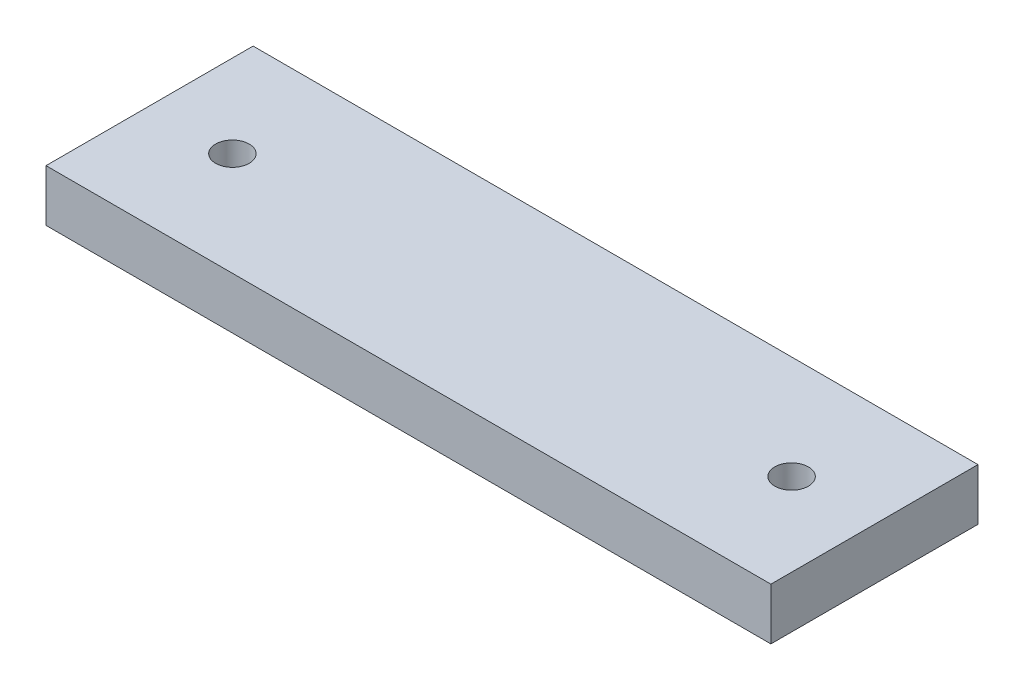
ISO-10303-21;
HEADER;
FILE_DESCRIPTION(('STEP AP214'),'2;1');
FILE_NAME('part.step','',(''),(''),'','','');
FILE_SCHEMA(('AUTOMOTIVE_DESIGN { 1 0 10303 214 1 1 1 1 }'));
ENDSEC;
DATA;
#1=APPLICATION_CONTEXT('core data for automotive mechanical design processes');
#2=APPLICATION_PROTOCOL_DEFINITION('international standard','automotive_design',2000,#1);
#3=PRODUCT_CONTEXT('',#1,'mechanical');
#4=PRODUCT('Part','Part','',(#3));
#5=PRODUCT_RELATED_PRODUCT_CATEGORY('part','',(#4));
#6=PRODUCT_DEFINITION_FORMATION('','',#4);
#7=PRODUCT_DEFINITION_CONTEXT('part definition',#1,'design');
#8=PRODUCT_DEFINITION('design','',#6,#7);
#9=PRODUCT_DEFINITION_SHAPE('','',#8);
#10=(LENGTH_UNIT() NAMED_UNIT(*) SI_UNIT(.MILLI.,.METRE.));
#11=(NAMED_UNIT(*) PLANE_ANGLE_UNIT() SI_UNIT($,.RADIAN.));
#12=(NAMED_UNIT(*) SI_UNIT($,.STERADIAN.) SOLID_ANGLE_UNIT());
#13=UNCERTAINTY_MEASURE_WITH_UNIT(LENGTH_MEASURE(1.E-05),#10,'distance_accuracy_value','');
#14=(GEOMETRIC_REPRESENTATION_CONTEXT(3) GLOBAL_UNCERTAINTY_ASSIGNED_CONTEXT((#13)) GLOBAL_UNIT_ASSIGNED_CONTEXT((#10,
#11,#12)) REPRESENTATION_CONTEXT('',''));
#15=CARTESIAN_POINT('',(0.,0.,0.));
#16=DIRECTION('',(0.,0.,1.));
#17=DIRECTION('',(1.,0.,0.));
#18=AXIS2_PLACEMENT_3D('',#15,#16,#17);
#19=CARTESIAN_POINT('',(0.,3.175,0.));
#20=DIRECTION('',(0.,-1.,0.));
#21=DIRECTION('',(0.,0.,-1.));
#22=AXIS2_PLACEMENT_3D('',#19,#20,#21);
#23=PLANE('',#22);
#24=CARTESIAN_POINT('',(-17.145,3.175,0.));
#25=DIRECTION('',(0.,1.,0.));
#26=DIRECTION('',(0.,0.,1.));
#27=AXIS2_PLACEMENT_3D('',#24,#25,#26);
#28=CIRCLE('',#27,1.0287);
#29=CARTESIAN_POINT('',(-17.145,3.175,1.0287));
#30=VERTEX_POINT('',#29);
#31=EDGE_CURVE('E100',#30,#30,#28,.T.);
#32=ORIENTED_EDGE('',*,*,#31,.F.);
#33=EDGE_LOOP('',(#32));
#34=FACE_BOUND('',#33,.T.);
#35=DIRECTION('',(0.,0.,-1.));
#36=VECTOR('',#35,1.);
#37=CARTESIAN_POINT('',(22.225,3.175,6.35));
#38=LINE('',#37,#36);
#39=CARTESIAN_POINT('',(22.225,3.175,6.35));
#40=VERTEX_POINT('',#39);
#41=CARTESIAN_POINT('',(22.225,3.175,-6.35));
#42=VERTEX_POINT('',#41);
#43=EDGE_CURVE('E85',#40,#42,#38,.T.);
#44=ORIENTED_EDGE('',*,*,#43,.T.);
#45=DIRECTION('',(-1.,0.,0.));
#46=VECTOR('',#45,1.);
#47=CARTESIAN_POINT('',(-22.225,3.175,-6.35));
#48=LINE('',#47,#46);
#49=CARTESIAN_POINT('',(-22.225,3.175,-6.35));
#50=VERTEX_POINT('',#49);
#51=EDGE_CURVE('E80',#42,#50,#48,.T.);
#52=ORIENTED_EDGE('',*,*,#51,.T.);
#53=DIRECTION('',(0.,0.,1.));
#54=VECTOR('',#53,1.);
#55=CARTESIAN_POINT('',(-22.225,3.175,6.35));
#56=LINE('',#55,#54);
#57=CARTESIAN_POINT('',(-22.225,3.175,6.35));
#58=VERTEX_POINT('',#57);
#59=EDGE_CURVE('E83',#50,#58,#56,.T.);
#60=ORIENTED_EDGE('',*,*,#59,.T.);
#61=DIRECTION('',(1.,0.,0.));
#62=VECTOR('',#61,1.);
#63=CARTESIAN_POINT('',(-22.225,3.175,6.35));
#64=LINE('',#63,#62);
#65=EDGE_CURVE('E50',#58,#40,#64,.T.);
#66=ORIENTED_EDGE('',*,*,#65,.T.);
#67=EDGE_LOOP('',(#44,#52,#60,#66));
#68=FACE_BOUND('',#67,.T.);
#69=CARTESIAN_POINT('',(17.145,3.175,0.));
#70=DIRECTION('',(0.,1.,0.));
#71=DIRECTION('',(0.,0.,-1.));
#72=AXIS2_PLACEMENT_3D('',#69,#70,#71);
#73=CIRCLE('',#72,1.0287);
#74=CARTESIAN_POINT('',(17.145,3.175,-1.0287));
#75=VERTEX_POINT('',#74);
#76=EDGE_CURVE('E115',#75,#75,#73,.T.);
#77=ORIENTED_EDGE('',*,*,#76,.F.);
#78=EDGE_LOOP('',(#77));
#79=FACE_BOUND('',#78,.T.);
#80=ADVANCED_FACE('F33',(#34,#68,#79),#23,.F.);
#81=CARTESIAN_POINT('',(0.,0.,0.));
#82=DIRECTION('',(0.,-1.,0.));
#83=DIRECTION('',(0.,0.,-1.));
#84=AXIS2_PLACEMENT_3D('',#81,#82,#83);
#85=PLANE('',#84);
#86=CARTESIAN_POINT('',(-17.145,0.,0.));
#87=DIRECTION('',(0.,1.,0.));
#88=DIRECTION('',(0.,0.,1.));
#89=AXIS2_PLACEMENT_3D('',#86,#87,#88);
#90=CIRCLE('',#89,1.0287);
#91=CARTESIAN_POINT('',(-17.145,0.,1.0287));
#92=VERTEX_POINT('',#91);
#93=EDGE_CURVE('E112',#92,#92,#90,.T.);
#94=ORIENTED_EDGE('',*,*,#93,.T.);
#95=EDGE_LOOP('',(#94));
#96=FACE_BOUND('',#95,.T.);
#97=DIRECTION('',(0.,0.,-1.));
#98=VECTOR('',#97,1.);
#99=CARTESIAN_POINT('',(22.225,0.,6.35));
#100=LINE('',#99,#98);
#101=CARTESIAN_POINT('',(22.225,0.,6.35));
#102=VERTEX_POINT('',#101);
#103=CARTESIAN_POINT('',(22.225,0.,-6.35));
#104=VERTEX_POINT('',#103);
#105=EDGE_CURVE('E97',#102,#104,#100,.T.);
#106=ORIENTED_EDGE('',*,*,#105,.F.);
#107=DIRECTION('',(1.,0.,0.));
#108=VECTOR('',#107,1.);
#109=CARTESIAN_POINT('',(-22.225,0.,6.35));
#110=LINE('',#109,#108);
#111=CARTESIAN_POINT('',(-22.225,0.,6.35));
#112=VERTEX_POINT('',#111);
#113=EDGE_CURVE('E73',#112,#102,#110,.T.);
#114=ORIENTED_EDGE('',*,*,#113,.F.);
#115=DIRECTION('',(0.,0.,1.));
#116=VECTOR('',#115,1.);
#117=CARTESIAN_POINT('',(-22.225,0.,6.35));
#118=LINE('',#117,#116);
#119=CARTESIAN_POINT('',(-22.225,0.,-6.35));
#120=VERTEX_POINT('',#119);
#121=EDGE_CURVE('E67',#120,#112,#118,.T.);
#122=ORIENTED_EDGE('',*,*,#121,.F.);
#123=DIRECTION('',(-1.,0.,0.));
#124=VECTOR('',#123,1.);
#125=CARTESIAN_POINT('',(-22.225,0.,-6.35));
#126=LINE('',#125,#124);
#127=EDGE_CURVE('E89',#104,#120,#126,.T.);
#128=ORIENTED_EDGE('',*,*,#127,.F.);
#129=EDGE_LOOP('',(#106,#114,#122,#128));
#130=FACE_BOUND('',#129,.T.);
#131=CARTESIAN_POINT('',(17.145,0.,0.));
#132=DIRECTION('',(0.,1.,0.));
#133=DIRECTION('',(0.,0.,-1.));
#134=AXIS2_PLACEMENT_3D('',#131,#132,#133);
#135=CIRCLE('',#134,1.0287);
#136=CARTESIAN_POINT('',(17.145,0.,-1.0287));
#137=VERTEX_POINT('',#136);
#138=EDGE_CURVE('E118',#137,#137,#135,.T.);
#139=ORIENTED_EDGE('',*,*,#138,.T.);
#140=EDGE_LOOP('',(#139));
#141=FACE_BOUND('',#140,.T.);
#142=ADVANCED_FACE('F108',(#96,#130,#141),#85,.T.);
#143=CARTESIAN_POINT('',(22.225,3.175,6.35));
#144=DIRECTION('',(-1.,0.,0.));
#145=DIRECTION('',(0.,0.,1.));
#146=AXIS2_PLACEMENT_3D('',#143,#144,#145);
#147=PLANE('',#146);
#148=ORIENTED_EDGE('',*,*,#105,.T.);
#149=DIRECTION('',(0.,-1.,0.));
#150=VECTOR('',#149,1.);
#151=CARTESIAN_POINT('',(22.225,3.175,-6.35));
#152=LINE('',#151,#150);
#153=EDGE_CURVE('E11',#42,#104,#152,.T.);
#154=ORIENTED_EDGE('',*,*,#153,.F.);
#155=ORIENTED_EDGE('',*,*,#43,.F.);
#156=DIRECTION('',(0.,-1.,0.));
#157=VECTOR('',#156,1.);
#158=CARTESIAN_POINT('',(22.225,3.175,6.35));
#159=LINE('',#158,#157);
#160=EDGE_CURVE('E93',#40,#102,#159,.T.);
#161=ORIENTED_EDGE('',*,*,#160,.T.);
#162=EDGE_LOOP('',(#148,#154,#155,#161));
#163=FACE_BOUND('',#162,.T.);
#164=ADVANCED_FACE('F35',(#163),#147,.F.);
#165=CARTESIAN_POINT('',(-22.225,3.175,-6.35));
#166=DIRECTION('',(0.,0.,1.));
#167=DIRECTION('',(1.,0.,0.));
#168=AXIS2_PLACEMENT_3D('',#165,#166,#167);
#169=PLANE('',#168);
#170=ORIENTED_EDGE('',*,*,#127,.T.);
#171=DIRECTION('',(0.,-1.,0.));
#172=VECTOR('',#171,1.);
#173=CARTESIAN_POINT('',(-22.225,3.175,-6.35));
#174=LINE('',#173,#172);
#175=EDGE_CURVE('E42',#50,#120,#174,.T.);
#176=ORIENTED_EDGE('',*,*,#175,.F.);
#177=ORIENTED_EDGE('',*,*,#51,.F.);
#178=ORIENTED_EDGE('',*,*,#153,.T.);
#179=EDGE_LOOP('',(#170,#176,#177,#178));
#180=FACE_BOUND('',#179,.T.);
#181=ADVANCED_FACE('F88',(#180),#169,.F.);
#182=CARTESIAN_POINT('',(-22.225,3.175,6.35));
#183=DIRECTION('',(1.,0.,0.));
#184=DIRECTION('',(0.,0.,-1.));
#185=AXIS2_PLACEMENT_3D('',#182,#183,#184);
#186=PLANE('',#185);
#187=ORIENTED_EDGE('',*,*,#121,.T.);
#188=DIRECTION('',(0.,-1.,0.));
#189=VECTOR('',#188,1.);
#190=CARTESIAN_POINT('',(-22.225,3.175,6.35));
#191=LINE('',#190,#189);
#192=EDGE_CURVE('E90',#58,#112,#191,.T.);
#193=ORIENTED_EDGE('',*,*,#192,.F.);
#194=ORIENTED_EDGE('',*,*,#59,.F.);
#195=ORIENTED_EDGE('',*,*,#175,.T.);
#196=EDGE_LOOP('',(#187,#193,#194,#195));
#197=FACE_BOUND('',#196,.T.);
#198=ADVANCED_FACE('F91',(#197),#186,.F.);
#199=CARTESIAN_POINT('',(-22.225,3.175,6.35));
#200=DIRECTION('',(0.,0.,-1.));
#201=DIRECTION('',(-1.,0.,0.));
#202=AXIS2_PLACEMENT_3D('',#199,#200,#201);
#203=PLANE('',#202);
#204=ORIENTED_EDGE('',*,*,#113,.T.);
#205=ORIENTED_EDGE('',*,*,#160,.F.);
#206=ORIENTED_EDGE('',*,*,#65,.F.);
#207=ORIENTED_EDGE('',*,*,#192,.T.);
#208=EDGE_LOOP('',(#204,#205,#206,#207));
#209=FACE_BOUND('',#208,.T.);
#210=ADVANCED_FACE('F105',(#209),#203,.F.);
#211=CARTESIAN_POINT('',(-17.145,3.175,0.));
#212=DIRECTION('',(0.,-1.,0.));
#213=DIRECTION('',(0.,0.,-1.));
#214=AXIS2_PLACEMENT_3D('',#211,#212,#213);
#215=CYLINDRICAL_SURFACE('',#214,1.0287);
#216=ORIENTED_EDGE('',*,*,#31,.T.);
#217=EDGE_LOOP('',(#216));
#218=FACE_BOUND('',#217,.T.);
#219=ORIENTED_EDGE('',*,*,#93,.F.);
#220=EDGE_LOOP('',(#219));
#221=FACE_BOUND('',#220,.T.);
#222=ADVANCED_FACE('F136',(#218,#221),#215,.F.);
#223=CARTESIAN_POINT('',(17.145,3.175,0.));
#224=DIRECTION('',(0.,-1.,0.));
#225=DIRECTION('',(0.,0.,-1.));
#226=AXIS2_PLACEMENT_3D('',#223,#224,#225);
#227=CYLINDRICAL_SURFACE('',#226,1.0287);
#228=ORIENTED_EDGE('',*,*,#76,.T.);
#229=EDGE_LOOP('',(#228));
#230=FACE_BOUND('',#229,.T.);
#231=ORIENTED_EDGE('',*,*,#138,.F.);
#232=EDGE_LOOP('',(#231));
#233=FACE_BOUND('',#232,.T.);
#234=ADVANCED_FACE('F124',(#230,#233),#227,.F.);
#235=CLOSED_SHELL('',(#80,#142,#164,#181,#198,#210,#222,#234));
#236=MANIFOLD_SOLID_BREP('B2',#235);
#237=ADVANCED_BREP_SHAPE_REPRESENTATION('',(#18,#236),#14);
#238=SHAPE_DEFINITION_REPRESENTATION(#9,#237);
ENDSEC;
END-ISO-10303-21;
